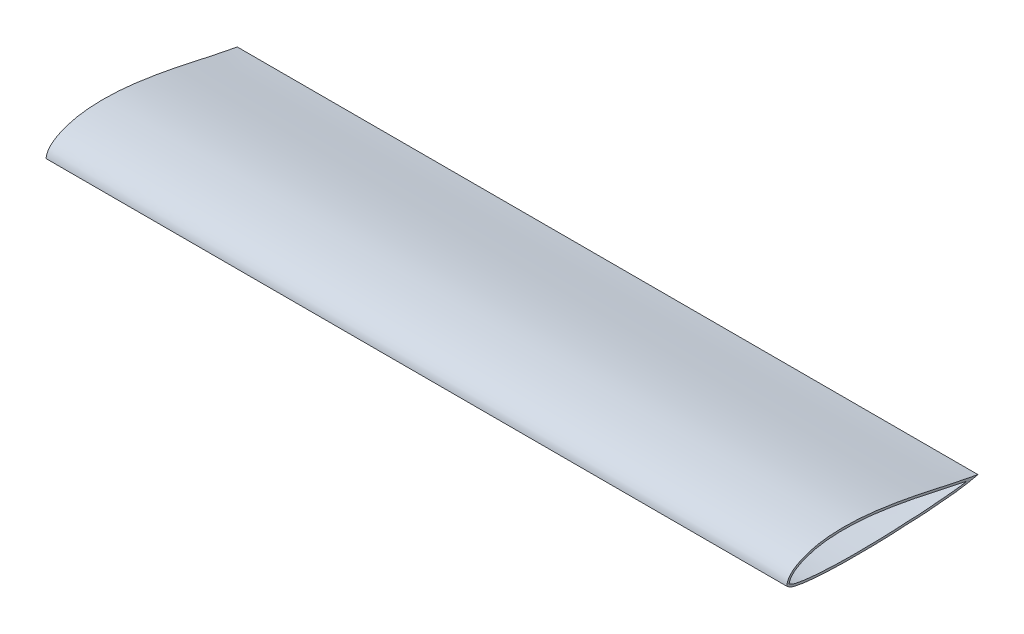
ISO-10303-21;
HEADER;
FILE_DESCRIPTION(('STEP AP214'),'2;1');
FILE_NAME('part.step','',(''),(''),'','','');
FILE_SCHEMA(('AUTOMOTIVE_DESIGN { 1 0 10303 214 1 1 1 1 }'));
ENDSEC;
DATA;
#1=APPLICATION_CONTEXT('core data for automotive mechanical design processes');
#2=APPLICATION_PROTOCOL_DEFINITION('international standard','automotive_design',2000,#1);
#3=PRODUCT_CONTEXT('',#1,'mechanical');
#4=PRODUCT('Part','Part','',(#3));
#5=PRODUCT_RELATED_PRODUCT_CATEGORY('part','',(#4));
#6=PRODUCT_DEFINITION_FORMATION('','',#4);
#7=PRODUCT_DEFINITION_CONTEXT('part definition',#1,'design');
#8=PRODUCT_DEFINITION('design','',#6,#7);
#9=PRODUCT_DEFINITION_SHAPE('','',#8);
#10=(LENGTH_UNIT() NAMED_UNIT(*) SI_UNIT(.MILLI.,.METRE.));
#11=(NAMED_UNIT(*) PLANE_ANGLE_UNIT() SI_UNIT($,.RADIAN.));
#12=(NAMED_UNIT(*) SI_UNIT($,.STERADIAN.) SOLID_ANGLE_UNIT());
#13=UNCERTAINTY_MEASURE_WITH_UNIT(LENGTH_MEASURE(1.E-05),#10,'distance_accuracy_value','');
#14=(GEOMETRIC_REPRESENTATION_CONTEXT(3) GLOBAL_UNCERTAINTY_ASSIGNED_CONTEXT((#13)) GLOBAL_UNIT_ASSIGNED_CONTEXT((#10,
#11,#12)) REPRESENTATION_CONTEXT('',''));
#15=CARTESIAN_POINT('',(0.,0.,0.));
#16=DIRECTION('',(0.,0.,1.));
#17=DIRECTION('',(1.,0.,0.));
#18=AXIS2_PLACEMENT_3D('',#15,#16,#17);
#19=CARTESIAN_POINT('',(-1.00000000000003,-1.1502683755476,243.310683058337));
#20=CARTESIAN_POINT('',(-1.00000000000003,-1.37568147784073,243.039240617205));
#21=CARTESIAN_POINT('',(-1.00000000000003,-1.71297085968348,242.633506164389));
#22=CARTESIAN_POINT('',(-1.00000000000003,-2.10938108908934,242.155147071681));
#23=CARTESIAN_POINT('',(-1.00000000000003,-2.33174986219365,241.888945063119));
#24=CARTESIAN_POINT('',(-1.00000000000003,-2.61179432397108,241.544427275037));
#25=CARTESIAN_POINT('',(-1.00000000000003,-2.92512461686368,241.134524109237));
#26=CARTESIAN_POINT('',(-1.00000000000003,-3.4091095928207,240.454666939163));
#27=CARTESIAN_POINT('',(-1.00000000000003,-4.17417671346167,239.249671591971));
#28=CARTESIAN_POINT('',(-1.00000000000003,-5.06742898670752,237.48052653323));
#29=CARTESIAN_POINT('',(-1.00000000000003,-5.87363296169006,235.336936227054));
#30=CARTESIAN_POINT('',(-1.00000000000003,-6.48181604446282,233.204940159793));
#31=CARTESIAN_POINT('',(-1.00000000000003,-6.95564995974327,231.107952771215));
#32=CARTESIAN_POINT('',(-1.00000000000003,-7.35081147042864,229.069092421125));
#33=CARTESIAN_POINT('',(-1.00000000000003,-7.85395570522768,226.435608535604));
#34=CARTESIAN_POINT('',(-1.00000000000003,-8.48356754792092,223.051507907465));
#35=CARTESIAN_POINT('',(-1.00000000000003,-9.05137370450853,218.917219850913));
#36=CARTESIAN_POINT('',(-1.00000000000003,-9.50809226136071,214.889667279397));
#37=CARTESIAN_POINT('',(-1.00000000000003,-10.0934790554163,209.503875729266));
#38=CARTESIAN_POINT('',(-1.00000000000003,-10.713609653779,202.734870404));
#39=CARTESIAN_POINT('',(-1.00000000000003,-11.2270594918661,194.614658124385));
#40=CARTESIAN_POINT('',(-1.00000000000003,-11.6319948503047,186.526679316408));
#41=CARTESIAN_POINT('',(-1.00000000000003,-12.0651891505777,175.730843126434));
#42=CARTESIAN_POINT('',(-1.00000000000003,-12.4001305043475,162.235996099967));
#43=CARTESIAN_POINT('',(-1.00000000000003,-12.4941817341527,146.030483639293));
#44=CARTESIAN_POINT('',(-1.00000000000003,-12.2320036810292,129.834671399064));
#45=CARTESIAN_POINT('',(-1.00000000000003,-11.9329245623016,116.395961347121));
#46=CARTESIAN_POINT('',(-1.00000000000003,-11.6304256855514,105.598117993319));
#47=CARTESIAN_POINT('',(-1.00000000000003,-11.2831681057211,97.4732639904196));
#48=CARTESIAN_POINT('',(-1.00000000000003,-10.7302085431911,89.3533319964186));
#49=CARTESIAN_POINT('',(-1.00000000000003,-10.2590880871262,82.6758489258513));
#50=CARTESIAN_POINT('',(-1.00000000000003,-10.0017520240164,77.3785339871055));
#51=CARTESIAN_POINT('',(-1.00000000000003,-9.9094580700525,74.0685692634164));
#52=CARTESIAN_POINT('',(-1.00000000000003,-9.90092202307066,71.4668978091757));
#53=CARTESIAN_POINT('',(-1.00000000000003,-9.90398780912744,68.6964364377852));
#54=CARTESIAN_POINT('',(-1.00000000000003,-9.79513826493795,65.2543084261125));
#55=CARTESIAN_POINT('',(-1.00000000000003,-9.55202783553569,61.1514560449754));
#56=CARTESIAN_POINT('',(-1.00000000000003,-9.11336077723726,55.7173609566722));
#57=CARTESIAN_POINT('',(-1.00000000000003,-8.43697443436425,48.9977037386976));
#58=CARTESIAN_POINT('',(-1.00000000000003,-7.7070938405344,41.0025019139367));
#59=CARTESIAN_POINT('',(-1.00000000000003,-7.03187546490813,32.9646624359399));
#60=CARTESIAN_POINT('',(-1.00000000000003,-6.34427957865074,24.915421709452));
#61=CARTESIAN_POINT('',(-1.00000000000003,-5.594595540465,16.8340705204431));
#62=CARTESIAN_POINT('',(-1.00000000000003,-4.7892207207485,10.061887315085));
#63=CARTESIAN_POINT('',(-1.00000000000003,-3.95177105495737,4.647610554305));
#64=CARTESIAN_POINT('',(-1.00000000000003,-3.3308323048459,1.25219180051967));
#65=CARTESIAN_POINT('',(-1.00000000000003,-2.76381146878573,-1.43138901646801));
#66=CARTESIAN_POINT('',(-1.00000000000003,-2.20919733815203,-4.05695153305181));
#67=CARTESIAN_POINT('',(-1.00000000000003,-1.2328069663744,-8.67888201538776));
#68=CARTESIAN_POINT('',(-1.00000000000003,-0.397894868222827,-12.6312123448251));
#69=CARTESIAN_POINT('',(-1.00000000000003,0.159156293833927,-15.2681713132739));
#70=B_SPLINE_CURVE_WITH_KNOTS('',3,(#19,#20,#21,#22,#23,#24,#25,#26,#27,#28,#29,#30,#31,#32,#33,
#34,#35,#36,#37,#38,#39,#40,#41,#42,#43,#44,#45,#46,#47,#48,#49,#50,#51,#52,#53,#54,#55,#56,#57,
#58,#59,#60,#61,#62,#63,#64,#65,#66,#67,#68,#69),.UNSPECIFIED.,.F.,.F.,(4,1,1,1,1,1,1,1,1,1,1,1,
1,1,1,1,1,1,1,1,1,1,1,1,1,1,1,1,1,1,1,1,1,1,1,1,1,1,1,1,1,1,1,1,1,1,1,1,4),
(-0.00714878525813267,-0.00297298242888244,-0.000885081014257327,0.00015886969305523,
0.00120282040036779,0.0032907218149929,0.00537862322961824,0.00955442605886847,
0.0179060317173689,0.0262576373758696,0.0346092430343703,0.0429608486928708,0.0513124543513714,
0.059664060009872,0.0763672713268733,0.0930704826438745,0.109773693960876,0.126476905277877,
0.159883327911879,0.193289750545882,0.226696173179884,0.260102595813887,0.326915441081891,
0.393728286349896,0.460541131617901,0.527353976885906,0.560760399519908,0.594166822153911,
0.627573244787913,0.660979667421915,0.677682878738917,0.694386090055918,0.702737695714418,
0.711089301372919,0.72779251268992,0.744495724006922,0.761198935323923,0.794605357957925,
0.828011780591928,0.86141820322593,0.894824625859932,0.928231048493935,0.961637471127937,
0.978340682444939,0.99504389376194,1.00339549942044,1.01174710507894,1.02845031639594,
1.06185673902994),.UNSPECIFIED.);
#71=DIRECTION('',(1.,0.,0.));
#72=VECTOR('',#71,1.);
#73=SURFACE_OF_LINEAR_EXTRUSION('',#70,#72);
#74=DIRECTION('',(1.,0.,0.));
#75=VECTOR('',#74,1.);
#76=CARTESIAN_POINT('',(-1.00000000000003,0.159156293833926,-15.2681713132739));
#77=LINE('',#76,#75);
#78=CARTESIAN_POINT('',(-1.00000000000003,0.159156293833926,-15.2681713132739));
#79=VERTEX_POINT('',#78);
#80=CARTESIAN_POINT('',(1000.,0.159156293833926,-15.2681713132739));
#81=VERTEX_POINT('',#80);
#82=EDGE_CURVE('E41',#79,#81,#77,.T.);
#83=ORIENTED_EDGE('',*,*,#82,.T.);
#84=CARTESIAN_POINT('',(1000.,-1.1502683755476,243.310683058337));
#85=CARTESIAN_POINT('',(1000.,-1.37568147784073,243.039240617205));
#86=CARTESIAN_POINT('',(1000.,-1.71297085968348,242.633506164389));
#87=CARTESIAN_POINT('',(1000.,-2.10938108908934,242.155147071681));
#88=CARTESIAN_POINT('',(1000.,-2.33174986219365,241.888945063119));
#89=CARTESIAN_POINT('',(1000.,-2.61179432397108,241.544427275037));
#90=CARTESIAN_POINT('',(1000.,-2.92512461686368,241.134524109237));
#91=CARTESIAN_POINT('',(1000.,-3.4091095928207,240.454666939163));
#92=CARTESIAN_POINT('',(1000.,-4.17417671346167,239.249671591971));
#93=CARTESIAN_POINT('',(1000.,-5.06742898670752,237.48052653323));
#94=CARTESIAN_POINT('',(1000.,-5.87363296169006,235.336936227054));
#95=CARTESIAN_POINT('',(1000.,-6.48181604446282,233.204940159793));
#96=CARTESIAN_POINT('',(1000.,-6.95564995974327,231.107952771215));
#97=CARTESIAN_POINT('',(1000.,-7.35081147042864,229.069092421125));
#98=CARTESIAN_POINT('',(1000.,-7.85395570522768,226.435608535604));
#99=CARTESIAN_POINT('',(1000.,-8.48356754792092,223.051507907465));
#100=CARTESIAN_POINT('',(1000.,-9.05137370450853,218.917219850913));
#101=CARTESIAN_POINT('',(1000.,-9.50809226136071,214.889667279397));
#102=CARTESIAN_POINT('',(1000.,-10.0934790554163,209.503875729266));
#103=CARTESIAN_POINT('',(1000.,-10.713609653779,202.734870404));
#104=CARTESIAN_POINT('',(1000.,-11.2270594918661,194.614658124385));
#105=CARTESIAN_POINT('',(1000.,-11.6319948503047,186.526679316408));
#106=CARTESIAN_POINT('',(1000.,-12.0651891505777,175.730843126434));
#107=CARTESIAN_POINT('',(1000.,-12.4001305043475,162.235996099967));
#108=CARTESIAN_POINT('',(1000.,-12.4941817341527,146.030483639293));
#109=CARTESIAN_POINT('',(1000.,-12.2320036810292,129.834671399064));
#110=CARTESIAN_POINT('',(1000.,-11.9329245623016,116.395961347121));
#111=CARTESIAN_POINT('',(1000.,-11.6304256855514,105.598117993319));
#112=CARTESIAN_POINT('',(1000.,-11.2831681057211,97.4732639904196));
#113=CARTESIAN_POINT('',(1000.,-10.7302085431911,89.3533319964186));
#114=CARTESIAN_POINT('',(1000.,-10.2590880871262,82.6758489258513));
#115=CARTESIAN_POINT('',(1000.,-10.0017520240164,77.3785339871055));
#116=CARTESIAN_POINT('',(1000.,-9.9094580700525,74.0685692634164));
#117=CARTESIAN_POINT('',(1000.,-9.90092202307066,71.4668978091757));
#118=CARTESIAN_POINT('',(1000.,-9.90398780912744,68.6964364377852));
#119=CARTESIAN_POINT('',(1000.,-9.79513826493795,65.2543084261125));
#120=CARTESIAN_POINT('',(1000.,-9.55202783553569,61.1514560449754));
#121=CARTESIAN_POINT('',(1000.,-9.11336077723726,55.7173609566722));
#122=CARTESIAN_POINT('',(1000.,-8.43697443436425,48.9977037386976));
#123=CARTESIAN_POINT('',(1000.,-7.7070938405344,41.0025019139367));
#124=CARTESIAN_POINT('',(1000.,-7.03187546490813,32.9646624359399));
#125=CARTESIAN_POINT('',(1000.,-6.34427957865074,24.915421709452));
#126=CARTESIAN_POINT('',(1000.,-5.594595540465,16.8340705204431));
#127=CARTESIAN_POINT('',(1000.,-4.7892207207485,10.061887315085));
#128=CARTESIAN_POINT('',(1000.,-3.95177105495737,4.647610554305));
#129=CARTESIAN_POINT('',(1000.,-3.3308323048459,1.25219180051967));
#130=CARTESIAN_POINT('',(1000.,-2.76381146878573,-1.43138901646801));
#131=CARTESIAN_POINT('',(1000.,-2.20919733815203,-4.05695153305181));
#132=CARTESIAN_POINT('',(1000.,-1.2328069663744,-8.67888201538776));
#133=CARTESIAN_POINT('',(1000.,-0.397894868222827,-12.6312123448251));
#134=CARTESIAN_POINT('',(1000.,0.159156293833927,-15.2681713132739));
#135=B_SPLINE_CURVE_WITH_KNOTS('',3,(#84,#85,#86,#87,#88,#89,#90,#91,#92,#93,#94,#95,#96,#97,
#98,#99,#100,#101,#102,#103,#104,#105,#106,#107,#108,#109,#110,#111,#112,#113,#114,#115,#116,
#117,#118,#119,#120,#121,#122,#123,#124,#125,#126,#127,#128,#129,#130,#131,#132,#133,#134),
.UNSPECIFIED.,.F.,.F.,(4,1,1,1,1,1,1,1,1,1,1,1,1,1,1,1,1,1,1,1,1,1,1,1,1,1,1,1,1,1,1,1,1,1,1,1,
1,1,1,1,1,1,1,1,1,1,1,1,4),(-0.00714878525813267,-0.00297298242888244,-0.000885081014257327,
0.00015886969305523,0.00120282040036779,0.0032907218149929,0.00537862322961824,
0.00955442605886847,0.0179060317173689,0.0262576373758696,0.0346092430343703,0.0429608486928708,
0.0513124543513714,0.059664060009872,0.0763672713268733,0.0930704826438745,0.109773693960876,
0.126476905277877,0.159883327911879,0.193289750545882,0.226696173179884,0.260102595813887,
0.326915441081891,0.393728286349896,0.460541131617901,0.527353976885906,0.560760399519908,
0.594166822153911,0.627573244787913,0.660979667421915,0.677682878738917,0.694386090055918,
0.702737695714418,0.711089301372919,0.72779251268992,0.744495724006922,0.761198935323923,
0.794605357957925,0.828011780591928,0.86141820322593,0.894824625859932,0.928231048493935,
0.961637471127937,0.978340682444939,0.99504389376194,1.00339549942044,1.01174710507894,
1.02845031639594,1.06185673902994),.UNSPECIFIED.);
#136=CARTESIAN_POINT('',(1000.,-1.1502683755476,243.310683058337));
#137=VERTEX_POINT('',#136);
#138=EDGE_CURVE('E90',#137,#81,#135,.T.);
#139=ORIENTED_EDGE('',*,*,#138,.F.);
#140=DIRECTION('',(1.,0.,0.));
#141=VECTOR('',#140,1.);
#142=CARTESIAN_POINT('',(-1.00000000000003,-1.1502683755476,243.310683058337));
#143=LINE('',#142,#141);
#144=CARTESIAN_POINT('',(-1.00000000000003,-1.1502683755476,243.310683058337));
#145=VERTEX_POINT('',#144);
#146=EDGE_CURVE('E11',#145,#137,#143,.T.);
#147=ORIENTED_EDGE('',*,*,#146,.F.);
#148=EDGE_CURVE('E84',#145,#79,#70,.T.);
#149=ORIENTED_EDGE('',*,*,#148,.T.);
#150=EDGE_LOOP('',(#83,#139,#147,#149));
#151=FACE_BOUND('',#150,.T.);
#152=ADVANCED_FACE('F37',(#151),#73,.T.);
#153=CARTESIAN_POINT('',(-1.00000000000003,0.159156293833926,-15.2681713132739));
#154=CARTESIAN_POINT('',(-1.00000000000003,0.678918583432907,-12.526262967808));
#155=CARTESIAN_POINT('',(-1.00000000000003,1.72486958078407,-7.04269550078225));
#156=CARTESIAN_POINT('',(-1.00000000000003,3.25523756789164,1.18415104319343));
#157=CARTESIAN_POINT('',(-1.00000000000003,4.9303150849236,9.30856704754341));
#158=CARTESIAN_POINT('',(-1.00000000000003,6.72875192476777,17.4660434431705));
#159=CARTESIAN_POINT('',(-1.00000000000003,8.54116356254806,25.6532503192837));
#160=CARTESIAN_POINT('',(-1.00000000000003,10.8889756388905,36.5809656286983));
#161=CARTESIAN_POINT('',(-1.00000000000003,13.7991316927362,50.1968971465116));
#162=CARTESIAN_POINT('',(-1.00000000000003,17.4230510822038,66.5699403405754));
#163=CARTESIAN_POINT('',(-1.00000000000003,20.5934849858876,83.1193651121608));
#164=CARTESIAN_POINT('',(-1.00000000000003,23.3814704242615,99.6530564503374));
#165=CARTESIAN_POINT('',(-1.00000000000003,25.9820909659318,116.267909511922));
#166=CARTESIAN_POINT('',(-1.00000000000003,27.9769773945351,133.021765482631));
#167=CARTESIAN_POINT('',(-1.00000000000003,29.2809014817748,149.846120890054));
#168=CARTESIAN_POINT('',(-1.00000000000003,29.7751701148894,166.751895398586));
#169=CARTESIAN_POINT('',(-1.00000000000003,29.3007797715484,180.902010237971));
#170=CARTESIAN_POINT('',(-1.00000000000003,28.1735481428705,192.197880579359));
#171=CARTESIAN_POINT('',(-1.00000000000003,26.9041705891967,200.662726552826));
#172=CARTESIAN_POINT('',(-1.00000000000003,25.3023282074801,207.675279817827));
#173=CARTESIAN_POINT('',(-1.00000000000003,23.7014324892997,213.172616695431));
#174=CARTESIAN_POINT('',(-1.00000000000003,22.3800143720317,217.227780323992));
#175=CARTESIAN_POINT('',(-1.00000000000003,20.9246771930038,221.307667342909));
#176=CARTESIAN_POINT('',(-1.00000000000003,19.0964257049546,225.395647069439));
#177=CARTESIAN_POINT('',(-1.00000000000003,16.9699069889481,229.222416024422));
#178=CARTESIAN_POINT('',(-1.00000000000003,14.6121466611031,232.973058982096));
#179=CARTESIAN_POINT('',(-1.00000000000003,11.7647573200699,236.588010137001));
#180=CARTESIAN_POINT('',(-1.00000000000003,8.83080097077843,239.240565442082));
#181=CARTESIAN_POINT('',(-1.00000000000003,6.05913961625018,240.986514665452));
#182=CARTESIAN_POINT('',(-1.00000000000003,4.14744134905635,241.880344750998));
#183=CARTESIAN_POINT('',(-1.00000000000003,2.50312900659145,242.456140173545));
#184=CARTESIAN_POINT('',(-1.00000000000003,1.44466569264131,242.753390645051));
#185=CARTESIAN_POINT('',(-1.00000000000003,0.539863487138438,242.953517187897));
#186=CARTESIAN_POINT('',(-1.00000000000003,-0.185368276964213,243.105270301671));
#187=CARTESIAN_POINT('',(-1.00000000000003,-0.769695449356252,243.229969158543));
#188=CARTESIAN_POINT('',(-1.00000000000003,-1.1502683755476,243.310683058337));
#189=B_SPLINE_CURVE_WITH_KNOTS('',3,(#153,#154,#155,#156,#157,#158,#159,#160,#161,#162,#163,
#164,#165,#166,#167,#168,#169,#170,#171,#172,#173,#174,#175,#176,#177,#178,#179,#180,#181,#182,
#183,#184,#185,#186,#187,#188),.UNSPECIFIED.,.F.,.F.,(4,1,1,1,1,1,1,1,1,1,1,1,1,1,1,1,1,1,1,1,1,
1,1,1,1,1,1,1,1,1,1,1,1,4),(-0.00646552577625987,0.026848156575089,0.060161838926438,
0.0934755212777871,0.126789203629136,0.160102885980485,0.193416568331834,0.260043933034532,
0.32667129773723,0.393298662439928,0.459926027142626,0.526553391845324,0.593180756548022,
0.65980812125072,0.726435485953418,0.793062850656116,0.826376533007464,0.859690215358814,
0.893003897710163,0.909660738885837,0.926317580061511,0.942974421237186,0.95963126241286,
0.976288103588535,0.992944944764209,1.00960178593988,1.02625862711556,1.0345870477034,
1.04291546829123,1.04707967858515,1.05124388887907,1.05332599402603,1.05540809917299,
1.05957230946691),.UNSPECIFIED.);
#190=DIRECTION('',(1.,0.,0.));
#191=VECTOR('',#190,1.);
#192=SURFACE_OF_LINEAR_EXTRUSION('',#189,#191);
#193=ORIENTED_EDGE('',*,*,#146,.T.);
#194=CARTESIAN_POINT('',(1000.,0.159156293833926,-15.2681713132739));
#195=CARTESIAN_POINT('',(1000.,0.678918583432907,-12.526262967808));
#196=CARTESIAN_POINT('',(1000.,1.72486958078407,-7.04269550078225));
#197=CARTESIAN_POINT('',(1000.,3.25523756789164,1.18415104319343));
#198=CARTESIAN_POINT('',(1000.,4.9303150849236,9.30856704754341));
#199=CARTESIAN_POINT('',(1000.,6.72875192476777,17.4660434431705));
#200=CARTESIAN_POINT('',(1000.,8.54116356254806,25.6532503192837));
#201=CARTESIAN_POINT('',(1000.,10.8889756388905,36.5809656286983));
#202=CARTESIAN_POINT('',(1000.,13.7991316927362,50.1968971465116));
#203=CARTESIAN_POINT('',(1000.,17.4230510822038,66.5699403405754));
#204=CARTESIAN_POINT('',(1000.,20.5934849858876,83.1193651121608));
#205=CARTESIAN_POINT('',(1000.,23.3814704242615,99.6530564503374));
#206=CARTESIAN_POINT('',(1000.,25.9820909659318,116.267909511922));
#207=CARTESIAN_POINT('',(1000.,27.9769773945351,133.021765482631));
#208=CARTESIAN_POINT('',(1000.,29.2809014817748,149.846120890054));
#209=CARTESIAN_POINT('',(1000.,29.7751701148894,166.751895398586));
#210=CARTESIAN_POINT('',(1000.,29.3007797715484,180.902010237971));
#211=CARTESIAN_POINT('',(1000.,28.1735481428705,192.197880579359));
#212=CARTESIAN_POINT('',(1000.,26.9041705891967,200.662726552826));
#213=CARTESIAN_POINT('',(1000.,25.3023282074801,207.675279817827));
#214=CARTESIAN_POINT('',(1000.,23.7014324892997,213.172616695431));
#215=CARTESIAN_POINT('',(1000.,22.3800143720317,217.227780323992));
#216=CARTESIAN_POINT('',(1000.,20.9246771930038,221.307667342909));
#217=CARTESIAN_POINT('',(1000.,19.0964257049546,225.395647069439));
#218=CARTESIAN_POINT('',(1000.,16.9699069889481,229.222416024422));
#219=CARTESIAN_POINT('',(1000.,14.6121466611031,232.973058982096));
#220=CARTESIAN_POINT('',(1000.,11.7647573200699,236.588010137001));
#221=CARTESIAN_POINT('',(1000.,8.83080097077843,239.240565442082));
#222=CARTESIAN_POINT('',(1000.,6.05913961625018,240.986514665452));
#223=CARTESIAN_POINT('',(1000.,4.14744134905635,241.880344750998));
#224=CARTESIAN_POINT('',(1000.,2.50312900659145,242.456140173545));
#225=CARTESIAN_POINT('',(1000.,1.44466569264131,242.753390645051));
#226=CARTESIAN_POINT('',(1000.,0.539863487138438,242.953517187897));
#227=CARTESIAN_POINT('',(1000.,-0.185368276964213,243.105270301671));
#228=CARTESIAN_POINT('',(1000.,-0.769695449356252,243.229969158543));
#229=CARTESIAN_POINT('',(1000.,-1.1502683755476,243.310683058337));
#230=B_SPLINE_CURVE_WITH_KNOTS('',3,(#194,#195,#196,#197,#198,#199,#200,#201,#202,#203,#204,
#205,#206,#207,#208,#209,#210,#211,#212,#213,#214,#215,#216,#217,#218,#219,#220,#221,#222,#223,
#224,#225,#226,#227,#228,#229),.UNSPECIFIED.,.F.,.F.,(4,1,1,1,1,1,1,1,1,1,1,1,1,1,1,1,1,1,1,1,1,
1,1,1,1,1,1,1,1,1,1,1,1,4),(-0.00646552577625987,0.026848156575089,0.060161838926438,
0.0934755212777871,0.126789203629136,0.160102885980485,0.193416568331834,0.260043933034532,
0.32667129773723,0.393298662439928,0.459926027142626,0.526553391845324,0.593180756548022,
0.65980812125072,0.726435485953418,0.793062850656116,0.826376533007464,0.859690215358814,
0.893003897710163,0.909660738885837,0.926317580061511,0.942974421237186,0.95963126241286,
0.976288103588535,0.992944944764209,1.00960178593988,1.02625862711556,1.0345870477034,
1.04291546829123,1.04707967858515,1.05124388887907,1.05332599402603,1.05540809917299,
1.05957230946691),.UNSPECIFIED.);
#231=EDGE_CURVE('E109',#81,#137,#230,.T.);
#232=ORIENTED_EDGE('',*,*,#231,.F.);
#233=ORIENTED_EDGE('',*,*,#82,.F.);
#234=EDGE_CURVE('E143',#79,#145,#189,.T.);
#235=ORIENTED_EDGE('',*,*,#234,.T.);
#236=EDGE_LOOP('',(#193,#232,#233,#235));
#237=FACE_BOUND('',#236,.T.);
#238=ADVANCED_FACE('F138',(#237),#192,.T.);
#239=CARTESIAN_POINT('',(-1.00000000000003,-11.8520302113,113.69259423265));
#240=DIRECTION('',(-1.,0.,0.));
#241=DIRECTION('',(0.,0.,1.));
#242=AXIS2_PLACEMENT_3D('',#239,#240,#241);
#243=PLANE('',#242);
#244=CARTESIAN_POINT('',(-1.00000000000003,0.,240.));
#245=CARTESIAN_POINT('',(-1.00000000000003,-2.88663712280927,236.523911789921));
#246=CARTESIAN_POINT('',(-1.00000000000003,-4.06778606087941,230.220810861395));
#247=CARTESIAN_POINT('',(-1.00000000000003,-5.64877990651582,222.028601874124));
#248=CARTESIAN_POINT('',(-1.00000000000003,-6.60851401532716,214.009642515101));
#249=CARTESIAN_POINT('',(-1.00000000000003,-7.65058139006474,204.019456847261));
#250=CARTESIAN_POINT('',(-1.00000000000003,-8.62100436946901,188.010543643801));
#251=CARTESIAN_POINT('',(-1.00000000000003,-9.35502805275515,168.008371033474));
#252=CARTESIAN_POINT('',(-1.00000000000003,-9.54465584837777,143.997445941081));
#253=CARTESIAN_POINT('',(-1.00000000000003,-9.00057164569615,119.996434597562));
#254=CARTESIAN_POINT('',(-1.00000000000003,-8.45231331914167,95.9841207137069));
#255=CARTESIAN_POINT('',(-1.00000000000003,-6.86154925632092,79.4444514819222));
#256=CARTESIAN_POINT('',(-1.00000000000003,-6.94135781790873,63.4128510279465));
#257=CARTESIAN_POINT('',(-1.00000000000003,-5.14929657813988,47.4214800178839));
#258=CARTESIAN_POINT('',(-1.00000000000003,-3.34616289016771,23.9519910613881));
#259=CARTESIAN_POINT('',(-1.00000000000003,-1.67223814751534,7.91601145609598));
#260=CARTESIAN_POINT('',(-1.00000000000003,0.,0.));
#261=B_SPLINE_CURVE_WITH_KNOTS('',3,(#244,#245,#246,#247,#248,#249,#250,#251,#252,#253,#254,
#255,#256,#257,#258,#259,#260),.UNSPECIFIED.,.F.,.F.,(4,1,1,1,1,1,1,1,1,1,1,1,1,1,4),(0.,
0.0534752742490124,0.078709310431568,0.103753203869046,0.153672751320013,0.203448048800785,
0.302856430572072,0.402198969890009,0.501554024856561,0.600954522211836,0.700430480598882,
0.70748041607058,0.79999645484155,0.899715684831644,1.),.UNSPECIFIED.);
#262=CARTESIAN_POINT('',(-1.00000000000003,0.,240.));
#263=VERTEX_POINT('',#262);
#264=CARTESIAN_POINT('',(-1.00000000000003,0.,0.));
#265=VERTEX_POINT('',#264);
#266=EDGE_CURVE('E52',#263,#265,#261,.T.);
#267=ORIENTED_EDGE('',*,*,#266,.T.);
#268=CARTESIAN_POINT('',(-1.00000000000003,0.,0.));
#269=CARTESIAN_POINT('',(-1.00000000000003,1.52360068225762,8.03746926130975));
#270=CARTESIAN_POINT('',(-1.00000000000003,5.17138323074117,23.9897917168263));
#271=CARTESIAN_POINT('',(-1.00000000000003,10.2205786034995,48.0059783922376));
#272=CARTESIAN_POINT('',(-1.00000000000003,15.5619770262737,71.9126579513757));
#273=CARTESIAN_POINT('',(-1.00000000000003,19.7588120032883,95.9537600079154));
#274=CARTESIAN_POINT('',(-1.00000000000003,23.5677508672796,119.918298993928));
#275=CARTESIAN_POINT('',(-1.00000000000003,26.0263882263808,143.945589986485));
#276=CARTESIAN_POINT('',(-1.00000000000003,26.9601439821251,168.007150596988));
#277=CARTESIAN_POINT('',(-1.00000000000003,25.8933216802265,188.104616678397));
#278=CARTESIAN_POINT('',(-1.00000000000003,23.2639042392419,204.156129060536));
#279=CARTESIAN_POINT('',(-1.00000000000003,20.3434828261758,214.111867769092));
#280=CARTESIAN_POINT('',(-1.00000000000003,17.4120912155664,222.175332594537));
#281=CARTESIAN_POINT('',(-1.00000000000003,12.3378274401084,231.611968899749));
#282=CARTESIAN_POINT('',(-1.00000000000003,6.88597595591278,238.539586147514));
#283=CARTESIAN_POINT('',(-1.00000000000003,0.,240.));
#284=B_SPLINE_CURVE_WITH_KNOTS('',3,(#268,#269,#270,#271,#272,#273,#274,#275,#276,#277,#278,
#279,#280,#281,#282,#283),.UNSPECIFIED.,.F.,.F.,(4,1,1,1,1,1,1,1,1,1,1,1,1,4),(0.,
0.0976537739938577,0.195364998835535,0.293026196954694,0.390079704897671,0.486695277187024,
0.582699676897636,0.678273314662547,0.77397516907434,0.822435696462195,0.872109787552887,
0.897672395288057,0.924653988799848,1.),.UNSPECIFIED.);
#285=EDGE_CURVE('E124',#265,#263,#284,.T.);
#286=ORIENTED_EDGE('',*,*,#285,.T.);
#287=EDGE_LOOP('',(#267,#286));
#288=FACE_BOUND('',#287,.T.);
#289=ORIENTED_EDGE('',*,*,#148,.F.);
#290=ORIENTED_EDGE('',*,*,#234,.F.);
#291=EDGE_LOOP('',(#289,#290));
#292=FACE_BOUND('',#291,.T.);
#293=ADVANCED_FACE('F135',(#288,#292),#243,.T.);
#294=DIRECTION('',(1.,0.,0.));
#295=VECTOR('',#294,1.);
#296=SURFACE_OF_LINEAR_EXTRUSION('',#261,#295);
#297=DIRECTION('',(1.,0.,0.));
#298=VECTOR('',#297,1.);
#299=CARTESIAN_POINT('',(-1.00000000000003,0.,240.));
#300=LINE('',#299,#298);
#301=CARTESIAN_POINT('',(1000.,0.,240.));
#302=VERTEX_POINT('',#301);
#303=EDGE_CURVE('E75',#263,#302,#300,.T.);
#304=ORIENTED_EDGE('',*,*,#303,.T.);
#305=CARTESIAN_POINT('',(1000.,0.,240.));
#306=CARTESIAN_POINT('',(1000.,-2.88663712280927,236.523911789921));
#307=CARTESIAN_POINT('',(1000.,-4.06778606087941,230.220810861395));
#308=CARTESIAN_POINT('',(1000.,-5.64877990651582,222.028601874124));
#309=CARTESIAN_POINT('',(1000.,-6.60851401532716,214.009642515101));
#310=CARTESIAN_POINT('',(1000.,-7.65058139006474,204.019456847261));
#311=CARTESIAN_POINT('',(1000.,-8.62100436946901,188.010543643801));
#312=CARTESIAN_POINT('',(1000.,-9.35502805275515,168.008371033474));
#313=CARTESIAN_POINT('',(1000.,-9.54465584837777,143.997445941081));
#314=CARTESIAN_POINT('',(1000.,-9.00057164569615,119.996434597562));
#315=CARTESIAN_POINT('',(1000.,-8.45231331914167,95.9841207137069));
#316=CARTESIAN_POINT('',(1000.,-6.86154925632092,79.4444514819222));
#317=CARTESIAN_POINT('',(1000.,-6.94135781790873,63.4128510279465));
#318=CARTESIAN_POINT('',(1000.,-5.14929657813988,47.4214800178839));
#319=CARTESIAN_POINT('',(1000.,-3.34616289016771,23.9519910613881));
#320=CARTESIAN_POINT('',(1000.,-1.67223814751534,7.91601145609598));
#321=CARTESIAN_POINT('',(1000.,0.,0.));
#322=B_SPLINE_CURVE_WITH_KNOTS('',3,(#305,#306,#307,#308,#309,#310,#311,#312,#313,#314,#315,
#316,#317,#318,#319,#320,#321),.UNSPECIFIED.,.F.,.F.,(4,1,1,1,1,1,1,1,1,1,1,1,1,1,4),(0.,
0.0534752742490124,0.078709310431568,0.103753203869046,0.153672751320013,0.203448048800785,
0.302856430572072,0.402198969890009,0.501554024856561,0.600954522211836,0.700430480598882,
0.70748041607058,0.79999645484155,0.899715684831644,1.),.UNSPECIFIED.);
#323=CARTESIAN_POINT('',(1000.,0.,0.));
#324=VERTEX_POINT('',#323);
#325=EDGE_CURVE('E79',#302,#324,#322,.T.);
#326=ORIENTED_EDGE('',*,*,#325,.T.);
#327=DIRECTION('',(1.,0.,0.));
#328=VECTOR('',#327,1.);
#329=CARTESIAN_POINT('',(-1.00000000000003,0.,0.));
#330=LINE('',#329,#328);
#331=EDGE_CURVE('E85',#265,#324,#330,.T.);
#332=ORIENTED_EDGE('',*,*,#331,.F.);
#333=ORIENTED_EDGE('',*,*,#266,.F.);
#334=EDGE_LOOP('',(#304,#326,#332,#333));
#335=FACE_BOUND('',#334,.T.);
#336=ADVANCED_FACE('F77',(#335),#296,.F.);
#337=DIRECTION('',(1.,0.,0.));
#338=VECTOR('',#337,1.);
#339=SURFACE_OF_LINEAR_EXTRUSION('',#284,#338);
#340=ORIENTED_EDGE('',*,*,#331,.T.);
#341=CARTESIAN_POINT('',(1000.,0.,0.));
#342=CARTESIAN_POINT('',(1000.,1.52360068225762,8.03746926130975));
#343=CARTESIAN_POINT('',(1000.,5.17138323074117,23.9897917168263));
#344=CARTESIAN_POINT('',(1000.,10.2205786034995,48.0059783922376));
#345=CARTESIAN_POINT('',(1000.,15.5619770262737,71.9126579513757));
#346=CARTESIAN_POINT('',(1000.,19.7588120032883,95.9537600079154));
#347=CARTESIAN_POINT('',(1000.,23.5677508672796,119.918298993928));
#348=CARTESIAN_POINT('',(1000.,26.0263882263808,143.945589986485));
#349=CARTESIAN_POINT('',(1000.,26.9601439821251,168.007150596988));
#350=CARTESIAN_POINT('',(1000.,25.8933216802265,188.104616678397));
#351=CARTESIAN_POINT('',(1000.,23.2639042392419,204.156129060536));
#352=CARTESIAN_POINT('',(1000.,20.3434828261758,214.111867769092));
#353=CARTESIAN_POINT('',(1000.,17.4120912155664,222.175332594537));
#354=CARTESIAN_POINT('',(1000.,12.3378274401084,231.611968899749));
#355=CARTESIAN_POINT('',(1000.,6.88597595591278,238.539586147514));
#356=CARTESIAN_POINT('',(1000.,0.,240.));
#357=B_SPLINE_CURVE_WITH_KNOTS('',3,(#341,#342,#343,#344,#345,#346,#347,#348,#349,#350,#351,
#352,#353,#354,#355,#356),.UNSPECIFIED.,.F.,.F.,(4,1,1,1,1,1,1,1,1,1,1,1,1,4),(0.,
0.0976537739938577,0.195364998835535,0.293026196954694,0.390079704897671,0.486695277187024,
0.582699676897636,0.678273314662547,0.77397516907434,0.822435696462195,0.872109787552887,
0.897672395288057,0.924653988799848,1.),.UNSPECIFIED.);
#358=EDGE_CURVE('E87',#324,#302,#357,.T.);
#359=ORIENTED_EDGE('',*,*,#358,.T.);
#360=ORIENTED_EDGE('',*,*,#303,.F.);
#361=ORIENTED_EDGE('',*,*,#285,.F.);
#362=EDGE_LOOP('',(#340,#359,#360,#361));
#363=FACE_BOUND('',#362,.T.);
#364=ADVANCED_FACE('F88',(#363),#339,.F.);
#365=CARTESIAN_POINT('',(1000.,-11.8520302113,113.69259423265));
#366=DIRECTION('',(-1.,0.,0.));
#367=DIRECTION('',(0.,0.,1.));
#368=AXIS2_PLACEMENT_3D('',#365,#366,#367);
#369=PLANE('',#368);
#370=ORIENTED_EDGE('',*,*,#138,.T.);
#371=ORIENTED_EDGE('',*,*,#231,.T.);
#372=EDGE_LOOP('',(#370,#371));
#373=FACE_BOUND('',#372,.T.);
#374=ORIENTED_EDGE('',*,*,#325,.F.);
#375=ORIENTED_EDGE('',*,*,#358,.F.);
#376=EDGE_LOOP('',(#374,#375));
#377=FACE_BOUND('',#376,.T.);
#378=ADVANCED_FACE('F92',(#373,#377),#369,.F.);
#379=CLOSED_SHELL('',(#152,#238,#293,#336,#364,#378));
#380=MANIFOLD_SOLID_BREP('B2',#379);
#381=ADVANCED_BREP_SHAPE_REPRESENTATION('',(#18,#380),#14);
#382=SHAPE_DEFINITION_REPRESENTATION(#9,#381);
ENDSEC;
END-ISO-10303-21;
